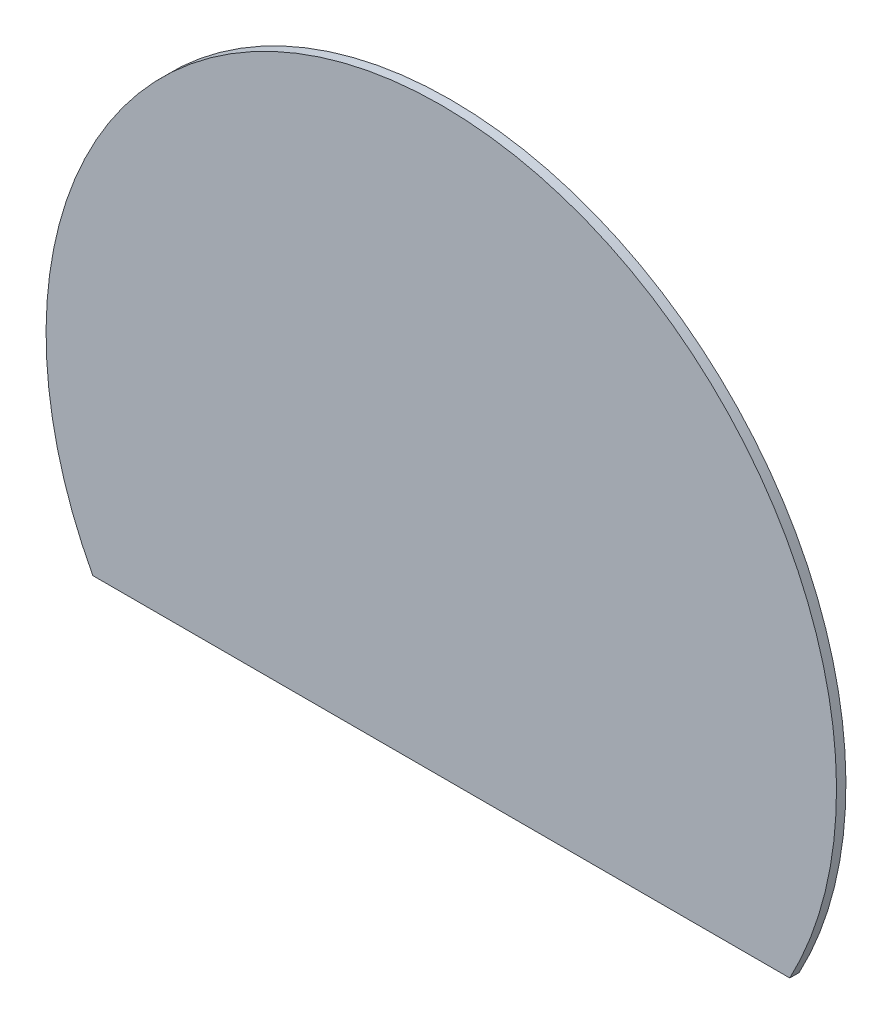
ISO-10303-21;
HEADER;
FILE_DESCRIPTION(('STEP AP214'),'2;1');
FILE_NAME('part.step','',(''),(''),'','','');
FILE_SCHEMA(('AUTOMOTIVE_DESIGN { 1 0 10303 214 1 1 1 1 }'));
ENDSEC;
DATA;
#1=APPLICATION_CONTEXT('core data for automotive mechanical design processes');
#2=APPLICATION_PROTOCOL_DEFINITION('international standard','automotive_design',2000,#1);
#3=PRODUCT_CONTEXT('',#1,'mechanical');
#4=PRODUCT('Part','Part','',(#3));
#5=PRODUCT_RELATED_PRODUCT_CATEGORY('part','',(#4));
#6=PRODUCT_DEFINITION_FORMATION('','',#4);
#7=PRODUCT_DEFINITION_CONTEXT('part definition',#1,'design');
#8=PRODUCT_DEFINITION('design','',#6,#7);
#9=PRODUCT_DEFINITION_SHAPE('','',#8);
#10=(LENGTH_UNIT() NAMED_UNIT(*) SI_UNIT(.MILLI.,.METRE.));
#11=(NAMED_UNIT(*) PLANE_ANGLE_UNIT() SI_UNIT($,.RADIAN.));
#12=(NAMED_UNIT(*) SI_UNIT($,.STERADIAN.) SOLID_ANGLE_UNIT());
#13=UNCERTAINTY_MEASURE_WITH_UNIT(LENGTH_MEASURE(1.E-05),#10,'distance_accuracy_value','');
#14=(GEOMETRIC_REPRESENTATION_CONTEXT(3) GLOBAL_UNCERTAINTY_ASSIGNED_CONTEXT((#13)) GLOBAL_UNIT_ASSIGNED_CONTEXT((#10,
#11,#12)) REPRESENTATION_CONTEXT('',''));
#15=CARTESIAN_POINT('',(0.,0.,0.));
#16=DIRECTION('',(0.,0.,1.));
#17=DIRECTION('',(1.,0.,0.));
#18=AXIS2_PLACEMENT_3D('',#15,#16,#17);
#19=CARTESIAN_POINT('',(0.,-99.076923076923,5.));
#20=DIRECTION('',(0.,1.,0.));
#21=DIRECTION('',(-1.,0.,0.));
#22=AXIS2_PLACEMENT_3D('',#19,#20,#21);
#23=PLANE('',#22);
#24=DIRECTION('',(1.,0.,0.));
#25=VECTOR('',#24,1.);
#26=CARTESIAN_POINT('',(0.,-99.076923076923,0.));
#27=LINE('',#26,#25);
#28=CARTESIAN_POINT('',(-185.158751652763,-99.076923076923,0.));
#29=VERTEX_POINT('',#28);
#30=CARTESIAN_POINT('',(185.158751652763,-99.076923076923,0.));
#31=VERTEX_POINT('',#30);
#32=EDGE_CURVE('E70',#29,#31,#27,.T.);
#33=ORIENTED_EDGE('',*,*,#32,.T.);
#34=DIRECTION('',(0.,0.,-1.));
#35=VECTOR('',#34,1.);
#36=CARTESIAN_POINT('',(185.158751652763,-99.076923076923,5.));
#37=LINE('',#36,#35);
#38=CARTESIAN_POINT('',(185.158751652763,-99.076923076923,5.));
#39=VERTEX_POINT('',#38);
#40=EDGE_CURVE('E11',#39,#31,#37,.T.);
#41=ORIENTED_EDGE('',*,*,#40,.F.);
#42=DIRECTION('',(1.,0.,0.));
#43=VECTOR('',#42,1.);
#44=CARTESIAN_POINT('',(0.,-99.076923076923,5.));
#45=LINE('',#44,#43);
#46=CARTESIAN_POINT('',(-185.158751652763,-99.076923076923,5.));
#47=VERTEX_POINT('',#46);
#48=EDGE_CURVE('E69',#47,#39,#45,.T.);
#49=ORIENTED_EDGE('',*,*,#48,.F.);
#50=DIRECTION('',(0.,0.,-1.));
#51=VECTOR('',#50,1.);
#52=CARTESIAN_POINT('',(-185.158751652763,-99.076923076923,5.));
#53=LINE('',#52,#51);
#54=EDGE_CURVE('E47',#47,#29,#53,.T.);
#55=ORIENTED_EDGE('',*,*,#54,.T.);
#56=EDGE_LOOP('',(#33,#41,#49,#55));
#57=FACE_BOUND('',#56,.T.);
#58=ADVANCED_FACE('F39',(#57),#23,.F.);
#59=CARTESIAN_POINT('',(0.,0.,5.));
#60=DIRECTION('',(0.,0.,-1.));
#61=DIRECTION('',(-1.,0.,0.));
#62=AXIS2_PLACEMENT_3D('',#59,#60,#61);
#63=CYLINDRICAL_SURFACE('',#62,210.);
#64=CARTESIAN_POINT('',(0.,0.,0.));
#65=DIRECTION('',(0.,0.,1.));
#66=DIRECTION('',(1.,0.,0.));
#67=AXIS2_PLACEMENT_3D('',#64,#65,#66);
#68=CIRCLE('',#67,210.);
#69=EDGE_CURVE('E62',#31,#29,#68,.T.);
#70=ORIENTED_EDGE('',*,*,#69,.T.);
#71=ORIENTED_EDGE('',*,*,#54,.F.);
#72=CARTESIAN_POINT('',(0.,0.,5.));
#73=DIRECTION('',(0.,0.,1.));
#74=DIRECTION('',(1.,0.,0.));
#75=AXIS2_PLACEMENT_3D('',#72,#73,#74);
#76=CIRCLE('',#75,210.);
#77=EDGE_CURVE('E54',#39,#47,#76,.T.);
#78=ORIENTED_EDGE('',*,*,#77,.F.);
#79=ORIENTED_EDGE('',*,*,#40,.T.);
#80=EDGE_LOOP('',(#70,#71,#78,#79));
#81=FACE_BOUND('',#80,.T.);
#82=ADVANCED_FACE('F65',(#81),#63,.T.);
#83=CARTESIAN_POINT('',(0.,0.,5.));
#84=DIRECTION('',(0.,0.,1.));
#85=DIRECTION('',(1.,0.,0.));
#86=AXIS2_PLACEMENT_3D('',#83,#84,#85);
#87=PLANE('',#86);
#88=ORIENTED_EDGE('',*,*,#48,.T.);
#89=ORIENTED_EDGE('',*,*,#77,.T.);
#90=EDGE_LOOP('',(#88,#89));
#91=FACE_BOUND('',#90,.T.);
#92=ADVANCED_FACE('F77',(#91),#87,.T.);
#93=CARTESIAN_POINT('',(0.,0.,0.));
#94=DIRECTION('',(0.,0.,1.));
#95=DIRECTION('',(1.,0.,0.));
#96=AXIS2_PLACEMENT_3D('',#93,#94,#95);
#97=PLANE('',#96);
#98=ORIENTED_EDGE('',*,*,#32,.F.);
#99=ORIENTED_EDGE('',*,*,#69,.F.);
#100=EDGE_LOOP('',(#98,#99));
#101=FACE_BOUND('',#100,.T.);
#102=ADVANCED_FACE('F73',(#101),#97,.F.);
#103=CLOSED_SHELL('',(#58,#82,#92,#102));
#104=MANIFOLD_SOLID_BREP('B2',#103);
#105=ADVANCED_BREP_SHAPE_REPRESENTATION('',(#18,#104),#14);
#106=SHAPE_DEFINITION_REPRESENTATION(#9,#105);
ENDSEC;
END-ISO-10303-21;
